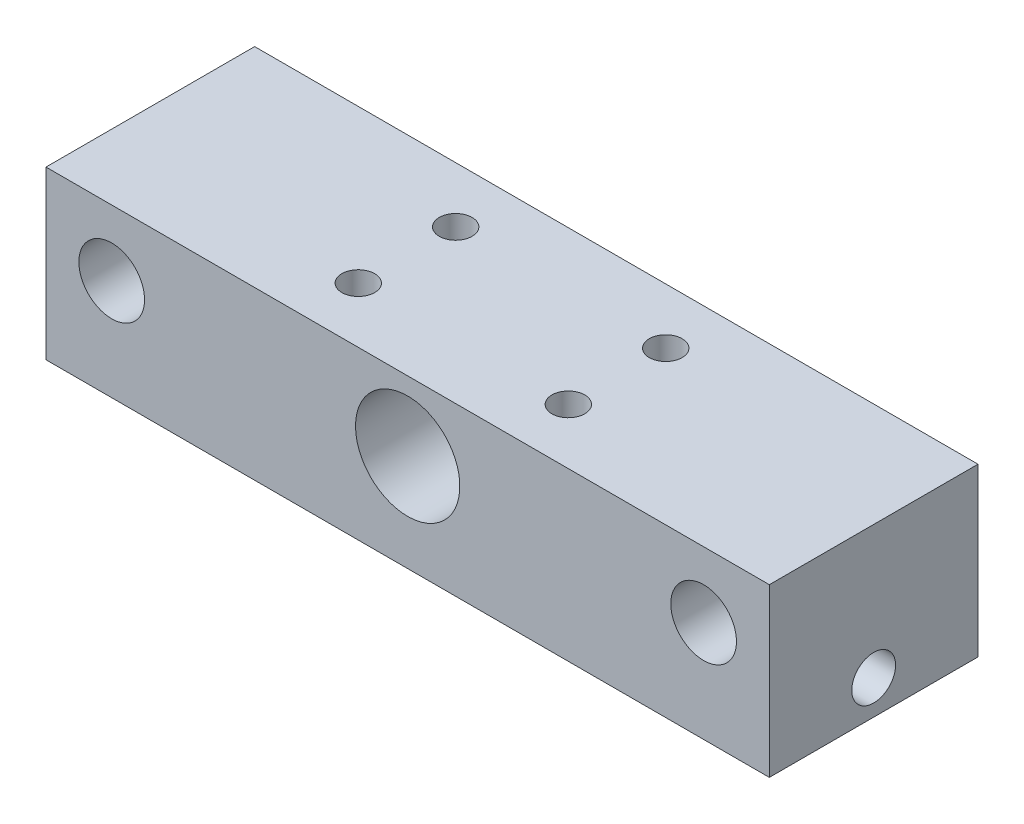
ISO-10303-21;
HEADER;
FILE_DESCRIPTION(('STEP AP214'),'2;1');
FILE_NAME('part.step','',(''),(''),'','','');
FILE_SCHEMA(('AUTOMOTIVE_DESIGN { 1 0 10303 214 1 1 1 1 }'));
ENDSEC;
DATA;
#1=APPLICATION_CONTEXT('core data for automotive mechanical design processes');
#2=APPLICATION_PROTOCOL_DEFINITION('international standard','automotive_design',2000,#1);
#3=PRODUCT_CONTEXT('',#1,'mechanical');
#4=PRODUCT('Part','Part','',(#3));
#5=PRODUCT_RELATED_PRODUCT_CATEGORY('part','',(#4));
#6=PRODUCT_DEFINITION_FORMATION('','',#4);
#7=PRODUCT_DEFINITION_CONTEXT('part definition',#1,'design');
#8=PRODUCT_DEFINITION('design','',#6,#7);
#9=PRODUCT_DEFINITION_SHAPE('','',#8);
#10=(LENGTH_UNIT() NAMED_UNIT(*) SI_UNIT(.MILLI.,.METRE.));
#11=(NAMED_UNIT(*) PLANE_ANGLE_UNIT() SI_UNIT($,.RADIAN.));
#12=(NAMED_UNIT(*) SI_UNIT($,.STERADIAN.) SOLID_ANGLE_UNIT());
#13=UNCERTAINTY_MEASURE_WITH_UNIT(LENGTH_MEASURE(1.E-05),#10,'distance_accuracy_value','');
#14=(GEOMETRIC_REPRESENTATION_CONTEXT(3) GLOBAL_UNCERTAINTY_ASSIGNED_CONTEXT((#13)) GLOBAL_UNIT_ASSIGNED_CONTEXT((#10,
#11,#12)) REPRESENTATION_CONTEXT('',''));
#15=CARTESIAN_POINT('',(0.,0.,0.));
#16=DIRECTION('',(0.,0.,1.));
#17=DIRECTION('',(1.,0.,0.));
#18=AXIS2_PLACEMENT_3D('',#15,#16,#17);
#19=CARTESIAN_POINT('',(0.,6.35,19.05));
#20=DIRECTION('',(0.,1.,0.));
#21=DIRECTION('',(0.,0.,1.));
#22=AXIS2_PLACEMENT_3D('',#19,#20,#21);
#23=PLANE('',#22);
#24=CARTESIAN_POINT('',(9.5885,6.35,13.97));
#25=DIRECTION('',(0.,1.,0.));
#26=DIRECTION('',(0.,0.,1.));
#27=AXIS2_PLACEMENT_3D('',#24,#25,#26);
#28=CIRCLE('',#27,1.4986);
#29=CARTESIAN_POINT('',(9.5885,6.35,15.4686));
#30=VERTEX_POINT('',#29);
#31=EDGE_CURVE('E155',#30,#30,#28,.F.);
#32=ORIENTED_EDGE('',*,*,#31,.T.);
#33=EDGE_LOOP('',(#32));
#34=FACE_BOUND('',#33,.T.);
#35=CARTESIAN_POINT('',(9.5885,6.35,5.08000000000001));
#36=DIRECTION('',(0.,1.,0.));
#37=DIRECTION('',(0.,0.,1.));
#38=AXIS2_PLACEMENT_3D('',#35,#36,#37);
#39=CIRCLE('',#38,1.4986);
#40=CARTESIAN_POINT('',(9.5885,6.35,6.57860000000001));
#41=VERTEX_POINT('',#40);
#42=EDGE_CURVE('E156',#41,#41,#39,.T.);
#43=ORIENTED_EDGE('',*,*,#42,.F.);
#44=EDGE_LOOP('',(#43));
#45=FACE_BOUND('',#44,.T.);
#46=CARTESIAN_POINT('',(-9.5885,6.35,13.97));
#47=DIRECTION('',(0.,1.,0.));
#48=DIRECTION('',(0.,0.,1.));
#49=AXIS2_PLACEMENT_3D('',#46,#47,#48);
#50=CIRCLE('',#49,1.4986);
#51=CARTESIAN_POINT('',(-9.5885,6.35,15.4686));
#52=VERTEX_POINT('',#51);
#53=EDGE_CURVE('E146',#52,#52,#50,.T.);
#54=ORIENTED_EDGE('',*,*,#53,.F.);
#55=EDGE_LOOP('',(#54));
#56=FACE_BOUND('',#55,.T.);
#57=DIRECTION('',(1.,0.,0.));
#58=VECTOR('',#57,1.);
#59=CARTESIAN_POINT('',(0.,6.35,0.));
#60=LINE('',#59,#58);
#61=CARTESIAN_POINT('',(-33.02,6.35,0.));
#62=VERTEX_POINT('',#61);
#63=CARTESIAN_POINT('',(33.02,6.35,0.));
#64=VERTEX_POINT('',#63);
#65=EDGE_CURVE('E121',#62,#64,#60,.T.);
#66=ORIENTED_EDGE('',*,*,#65,.F.);
#67=DIRECTION('',(0.,0.,-1.));
#68=VECTOR('',#67,1.);
#69=CARTESIAN_POINT('',(-33.02,6.35,19.05));
#70=LINE('',#69,#68);
#71=CARTESIAN_POINT('',(-33.02,6.35,19.05));
#72=VERTEX_POINT('',#71);
#73=EDGE_CURVE('E54',#72,#62,#70,.T.);
#74=ORIENTED_EDGE('',*,*,#73,.F.);
#75=DIRECTION('',(1.,0.,0.));
#76=VECTOR('',#75,1.);
#77=CARTESIAN_POINT('',(0.,6.35,19.05));
#78=LINE('',#77,#76);
#79=CARTESIAN_POINT('',(33.02,6.35,19.05));
#80=VERTEX_POINT('',#79);
#81=EDGE_CURVE('E132',#72,#80,#78,.T.);
#82=ORIENTED_EDGE('',*,*,#81,.T.);
#83=DIRECTION('',(0.,0.,-1.));
#84=VECTOR('',#83,1.);
#85=CARTESIAN_POINT('',(33.02,6.35,19.05));
#86=LINE('',#85,#84);
#87=EDGE_CURVE('E12',#80,#64,#86,.T.);
#88=ORIENTED_EDGE('',*,*,#87,.T.);
#89=EDGE_LOOP('',(#66,#74,#82,#88));
#90=FACE_BOUND('',#89,.T.);
#91=CARTESIAN_POINT('',(-9.5885,6.35,5.08000000000001));
#92=DIRECTION('',(0.,1.,0.));
#93=DIRECTION('',(0.,0.,1.));
#94=AXIS2_PLACEMENT_3D('',#91,#92,#93);
#95=CIRCLE('',#94,1.4986);
#96=CARTESIAN_POINT('',(-9.5885,6.35,6.57860000000001));
#97=VERTEX_POINT('',#96);
#98=EDGE_CURVE('E149',#97,#97,#95,.F.);
#99=ORIENTED_EDGE('',*,*,#98,.T.);
#100=EDGE_LOOP('',(#99));
#101=FACE_BOUND('',#100,.T.);
#102=ADVANCED_FACE('F44',(#34,#45,#56,#90,#101),#23,.T.);
#103=CARTESIAN_POINT('',(-33.02,0.,19.05));
#104=DIRECTION('',(1.,0.,0.));
#105=DIRECTION('',(0.,0.,-1.));
#106=AXIS2_PLACEMENT_3D('',#103,#104,#105);
#107=PLANE('',#106);
#108=CARTESIAN_POINT('',(-33.02,-5.76961,9.525));
#109=DIRECTION('',(-1.,0.,0.));
#110=DIRECTION('',(0.,0.,1.));
#111=AXIS2_PLACEMENT_3D('',#108,#109,#110);
#112=CIRCLE('',#111,2.00025);
#113=CARTESIAN_POINT('',(-33.02,-5.76961,11.52525));
#114=VERTEX_POINT('',#113);
#115=EDGE_CURVE('E106',#114,#114,#112,.T.);
#116=ORIENTED_EDGE('',*,*,#115,.F.);
#117=EDGE_LOOP('',(#116));
#118=FACE_BOUND('',#117,.T.);
#119=DIRECTION('',(0.,-1.,0.));
#120=VECTOR('',#119,1.);
#121=CARTESIAN_POINT('',(-33.02,0.,0.));
#122=LINE('',#121,#120);
#123=CARTESIAN_POINT('',(-33.02,-8.89,0.));
#124=VERTEX_POINT('',#123);
#125=EDGE_CURVE('E88',#62,#124,#122,.T.);
#126=ORIENTED_EDGE('',*,*,#125,.T.);
#127=DIRECTION('',(0.,0.,-1.));
#128=VECTOR('',#127,1.);
#129=CARTESIAN_POINT('',(-33.02,-8.89,19.05));
#130=LINE('',#129,#128);
#131=CARTESIAN_POINT('',(-33.02,-8.89,19.05));
#132=VERTEX_POINT('',#131);
#133=EDGE_CURVE('E91',#132,#124,#130,.T.);
#134=ORIENTED_EDGE('',*,*,#133,.F.);
#135=DIRECTION('',(0.,-1.,0.));
#136=VECTOR('',#135,1.);
#137=CARTESIAN_POINT('',(-33.02,0.,19.05));
#138=LINE('',#137,#136);
#139=EDGE_CURVE('E114',#72,#132,#138,.T.);
#140=ORIENTED_EDGE('',*,*,#139,.F.);
#141=ORIENTED_EDGE('',*,*,#73,.T.);
#142=EDGE_LOOP('',(#126,#134,#140,#141));
#143=FACE_BOUND('',#142,.T.);
#144=ADVANCED_FACE('F90',(#118,#143),#107,.F.);
#145=CARTESIAN_POINT('',(33.02,0.,19.05));
#146=DIRECTION('',(1.,0.,0.));
#147=DIRECTION('',(0.,0.,-1.));
#148=AXIS2_PLACEMENT_3D('',#145,#146,#147);
#149=PLANE('',#148);
#150=CARTESIAN_POINT('',(33.02,-5.76961,9.525));
#151=DIRECTION('',(1.,0.,0.));
#152=DIRECTION('',(0.,0.,-1.));
#153=AXIS2_PLACEMENT_3D('',#150,#151,#152);
#154=CIRCLE('',#153,2.00025);
#155=CARTESIAN_POINT('',(33.02,-5.76961,7.52475));
#156=VERTEX_POINT('',#155);
#157=EDGE_CURVE('E140',#156,#156,#154,.T.);
#158=ORIENTED_EDGE('',*,*,#157,.F.);
#159=EDGE_LOOP('',(#158));
#160=FACE_BOUND('',#159,.T.);
#161=DIRECTION('',(0.,-1.,0.));
#162=VECTOR('',#161,1.);
#163=CARTESIAN_POINT('',(33.02,0.,0.));
#164=LINE('',#163,#162);
#165=CARTESIAN_POINT('',(33.02,-8.89,0.));
#166=VERTEX_POINT('',#165);
#167=EDGE_CURVE('E82',#64,#166,#164,.T.);
#168=ORIENTED_EDGE('',*,*,#167,.F.);
#169=ORIENTED_EDGE('',*,*,#87,.F.);
#170=DIRECTION('',(0.,-1.,0.));
#171=VECTOR('',#170,1.);
#172=CARTESIAN_POINT('',(33.02,0.,19.05));
#173=LINE('',#172,#171);
#174=CARTESIAN_POINT('',(33.02,-8.89,19.05));
#175=VERTEX_POINT('',#174);
#176=EDGE_CURVE('E134',#80,#175,#173,.T.);
#177=ORIENTED_EDGE('',*,*,#176,.T.);
#178=DIRECTION('',(0.,0.,-1.));
#179=VECTOR('',#178,1.);
#180=CARTESIAN_POINT('',(33.02,-8.89,19.05));
#181=LINE('',#180,#179);
#182=EDGE_CURVE('E48',#175,#166,#181,.T.);
#183=ORIENTED_EDGE('',*,*,#182,.T.);
#184=EDGE_LOOP('',(#168,#169,#177,#183));
#185=FACE_BOUND('',#184,.T.);
#186=ADVANCED_FACE('F240',(#160,#185),#149,.T.);
#187=CARTESIAN_POINT('',(-27.02052,0.35052,19.05));
#188=DIRECTION('',(0.,0.,-1.));
#189=DIRECTION('',(-1.,0.,0.));
#190=AXIS2_PLACEMENT_3D('',#187,#188,#189);
#191=CYLINDRICAL_SURFACE('',#190,2.99974);
#192=CARTESIAN_POINT('',(-27.02052,0.35052,19.05));
#193=DIRECTION('',(0.,0.,1.));
#194=DIRECTION('',(1.,0.,0.));
#195=AXIS2_PLACEMENT_3D('',#192,#193,#194);
#196=CIRCLE('',#195,2.99974);
#197=CARTESIAN_POINT('',(-30.02026,0.35052,19.05));
#198=VERTEX_POINT('',#197);
#199=EDGE_CURVE('E126',#198,#198,#196,.T.);
#200=CARTESIAN_POINT('',(-27.02052,0.35052,0.));
#201=DIRECTION('',(0.,0.,1.));
#202=DIRECTION('',(1.,0.,0.));
#203=AXIS2_PLACEMENT_3D('',#200,#201,#202);
#204=CIRCLE('',#203,2.99974);
#205=CARTESIAN_POINT('',(-30.02026,0.35052,0.));
#206=VERTEX_POINT('',#205);
#207=EDGE_CURVE('E115',#206,#206,#204,.T.);
#208=CARTESIAN_POINT('',(-30.02026,0.35052,19.05));
#209=CARTESIAN_POINT('',(-30.02026,0.35052,18.8515625));
#210=CARTESIAN_POINT('',(-30.02026,0.35052,18.653125));
#211=CARTESIAN_POINT('',(-30.02026,0.35052,18.25625));
#212=CARTESIAN_POINT('',(-30.02026,0.35052,18.0578125));
#213=CARTESIAN_POINT('',(-30.02026,0.35052,17.6609375));
#214=CARTESIAN_POINT('',(-30.02026,0.35052,17.4625));
#215=CARTESIAN_POINT('',(-30.02026,0.35052,17.065625));
#216=CARTESIAN_POINT('',(-30.02026,0.35052,16.8671875));
#217=CARTESIAN_POINT('',(-30.02026,0.35052,16.4703125));
#218=CARTESIAN_POINT('',(-30.02026,0.35052,16.271875));
#219=CARTESIAN_POINT('',(-30.02026,0.35052,15.875));
#220=CARTESIAN_POINT('',(-30.02026,0.35052,15.6765625));
#221=CARTESIAN_POINT('',(-30.02026,0.35052,15.2796875));
#222=CARTESIAN_POINT('',(-30.02026,0.35052,15.08125));
#223=CARTESIAN_POINT('',(-30.02026,0.35052,14.684375));
#224=CARTESIAN_POINT('',(-30.02026,0.35052,14.4859375));
#225=CARTESIAN_POINT('',(-30.02026,0.35052,14.0890625));
#226=CARTESIAN_POINT('',(-30.02026,0.35052,13.890625));
#227=CARTESIAN_POINT('',(-30.02026,0.35052,13.49375));
#228=CARTESIAN_POINT('',(-30.02026,0.35052,13.2953125));
#229=CARTESIAN_POINT('',(-30.02026,0.35052,12.8984375));
#230=CARTESIAN_POINT('',(-30.02026,0.35052,12.7));
#231=CARTESIAN_POINT('',(-30.02026,0.35052,12.303125));
#232=CARTESIAN_POINT('',(-30.02026,0.35052,12.1046875));
#233=CARTESIAN_POINT('',(-30.02026,0.35052,11.7078125));
#234=CARTESIAN_POINT('',(-30.02026,0.35052,11.509375));
#235=CARTESIAN_POINT('',(-30.02026,0.35052,11.1125));
#236=CARTESIAN_POINT('',(-30.02026,0.35052,10.9140625));
#237=CARTESIAN_POINT('',(-30.02026,0.35052,10.5171875));
#238=CARTESIAN_POINT('',(-30.02026,0.35052,10.31875));
#239=CARTESIAN_POINT('',(-30.02026,0.35052,9.921875));
#240=CARTESIAN_POINT('',(-30.02026,0.35052,9.7234375));
#241=CARTESIAN_POINT('',(-30.02026,0.35052,9.3265625));
#242=CARTESIAN_POINT('',(-30.02026,0.35052,9.128125));
#243=CARTESIAN_POINT('',(-30.02026,0.35052,8.73125));
#244=CARTESIAN_POINT('',(-30.02026,0.35052,8.5328125));
#245=CARTESIAN_POINT('',(-30.02026,0.35052,8.1359375));
#246=CARTESIAN_POINT('',(-30.02026,0.35052,7.9375));
#247=CARTESIAN_POINT('',(-30.02026,0.35052,7.540625));
#248=CARTESIAN_POINT('',(-30.02026,0.35052,7.3421875));
#249=CARTESIAN_POINT('',(-30.02026,0.35052,6.9453125));
#250=CARTESIAN_POINT('',(-30.02026,0.35052,6.746875));
#251=CARTESIAN_POINT('',(-30.02026,0.35052,6.35));
#252=CARTESIAN_POINT('',(-30.02026,0.35052,6.1515625));
#253=CARTESIAN_POINT('',(-30.02026,0.35052,5.7546875));
#254=CARTESIAN_POINT('',(-30.02026,0.35052,5.55625));
#255=CARTESIAN_POINT('',(-30.02026,0.35052,5.159375));
#256=CARTESIAN_POINT('',(-30.02026,0.35052,4.9609375));
#257=CARTESIAN_POINT('',(-30.02026,0.35052,4.5640625));
#258=CARTESIAN_POINT('',(-30.02026,0.35052,4.365625));
#259=CARTESIAN_POINT('',(-30.02026,0.35052,3.96875));
#260=CARTESIAN_POINT('',(-30.02026,0.35052,3.7703125));
#261=CARTESIAN_POINT('',(-30.02026,0.35052,3.3734375));
#262=CARTESIAN_POINT('',(-30.02026,0.35052,3.175));
#263=CARTESIAN_POINT('',(-30.02026,0.35052,2.778125));
#264=CARTESIAN_POINT('',(-30.02026,0.35052,2.5796875));
#265=CARTESIAN_POINT('',(-30.02026,0.35052,2.1828125));
#266=CARTESIAN_POINT('',(-30.02026,0.35052,1.984375));
#267=CARTESIAN_POINT('',(-30.02026,0.35052,1.5875));
#268=CARTESIAN_POINT('',(-30.02026,0.35052,1.3890625));
#269=CARTESIAN_POINT('',(-30.02026,0.35052,0.992187500000001));
#270=CARTESIAN_POINT('',(-30.02026,0.35052,0.793750000000001));
#271=CARTESIAN_POINT('',(-30.02026,0.35052,0.396875));
#272=CARTESIAN_POINT('',(-30.02026,0.35052,0.1984375));
#273=CARTESIAN_POINT('',(-30.02026,0.35052,0.));
#274=B_SPLINE_CURVE_WITH_KNOTS('',3,(#208,#209,#210,#211,#212,#213,#214,#215,#216,#217,#218,
#219,#220,#221,#222,#223,#224,#225,#226,#227,#228,#229,#230,#231,#232,#233,#234,#235,#236,#237,
#238,#239,#240,#241,#242,#243,#244,#245,#246,#247,#248,#249,#250,#251,#252,#253,#254,#255,#256,
#257,#258,#259,#260,#261,#262,#263,#264,#265,#266,#267,#268,#269,#270,#271,#272,#273),
.UNSPECIFIED.,.F.,.F.,(4,2,2,2,2,2,2,2,2,2,2,2,2,2,2,2,2,2,2,2,2,2,2,2,2,2,2,2,2,2,2,2,4),(0.,
0.595312499999997,1.190625,1.7859375,2.38125,2.9765625,3.571875,4.1671875,4.7625,5.3578125,
5.953125,6.5484375,7.14375,7.7390625,8.334375,8.9296875,9.525,10.1203125,10.715625,11.3109375,
11.90625,12.5015625,13.096875,13.6921875,14.2875,14.8828125,15.478125,16.0734375,16.66875,
17.2640625,17.859375,18.4546875,19.05),.UNSPECIFIED.);
#275=EDGE_CURVE('BSEAM237',#198,#206,#274,.T.);
#276=ORIENTED_EDGE('',*,*,#199,.T.);
#277=ORIENTED_EDGE('',*,*,#207,.F.);
#278=ORIENTED_EDGE('',*,*,#275,.T.);
#279=ORIENTED_EDGE('',*,*,#275,.F.);
#280=EDGE_LOOP('',(#276,#278,#277,#279));
#281=FACE_BOUND('',#280,.T.);
#282=ADVANCED_FACE('F237',(#281),#191,.F.);
#283=CARTESIAN_POINT('',(0.,0.,19.05));
#284=DIRECTION('',(0.,0.,-1.));
#285=DIRECTION('',(-1.,0.,0.));
#286=AXIS2_PLACEMENT_3D('',#283,#284,#285);
#287=CYLINDRICAL_SURFACE('',#286,4.7625);
#288=CARTESIAN_POINT('',(0.,0.,19.05));
#289=DIRECTION('',(0.,0.,1.));
#290=DIRECTION('',(1.,0.,0.));
#291=AXIS2_PLACEMENT_3D('',#288,#289,#290);
#292=CIRCLE('',#291,4.7625);
#293=CARTESIAN_POINT('',(-4.7625,0.,19.05));
#294=VERTEX_POINT('',#293);
#295=EDGE_CURVE('E129',#294,#294,#292,.T.);
#296=CARTESIAN_POINT('',(0.,0.,0.));
#297=DIRECTION('',(0.,0.,1.));
#298=DIRECTION('',(1.,0.,0.));
#299=AXIS2_PLACEMENT_3D('',#296,#297,#298);
#300=CIRCLE('',#299,4.7625);
#301=CARTESIAN_POINT('',(-4.7625,0.,0.));
#302=VERTEX_POINT('',#301);
#303=EDGE_CURVE('E118',#302,#302,#300,.T.);
#304=CARTESIAN_POINT('',(-4.7625,0.,19.05));
#305=CARTESIAN_POINT('',(-4.7625,0.,18.8515625));
#306=CARTESIAN_POINT('',(-4.7625,0.,18.653125));
#307=CARTESIAN_POINT('',(-4.7625,0.,18.25625));
#308=CARTESIAN_POINT('',(-4.7625,0.,18.0578125));
#309=CARTESIAN_POINT('',(-4.7625,0.,17.6609375));
#310=CARTESIAN_POINT('',(-4.7625,0.,17.4625));
#311=CARTESIAN_POINT('',(-4.7625,0.,17.065625));
#312=CARTESIAN_POINT('',(-4.7625,0.,16.8671875));
#313=CARTESIAN_POINT('',(-4.7625,0.,16.4703125));
#314=CARTESIAN_POINT('',(-4.7625,0.,16.271875));
#315=CARTESIAN_POINT('',(-4.7625,0.,15.875));
#316=CARTESIAN_POINT('',(-4.7625,0.,15.6765625));
#317=CARTESIAN_POINT('',(-4.7625,0.,15.2796875));
#318=CARTESIAN_POINT('',(-4.7625,0.,15.08125));
#319=CARTESIAN_POINT('',(-4.7625,0.,14.684375));
#320=CARTESIAN_POINT('',(-4.7625,0.,14.4859375));
#321=CARTESIAN_POINT('',(-4.7625,0.,14.0890625));
#322=CARTESIAN_POINT('',(-4.7625,0.,13.890625));
#323=CARTESIAN_POINT('',(-4.7625,0.,13.49375));
#324=CARTESIAN_POINT('',(-4.7625,0.,13.2953125));
#325=CARTESIAN_POINT('',(-4.7625,0.,12.8984375));
#326=CARTESIAN_POINT('',(-4.7625,0.,12.7));
#327=CARTESIAN_POINT('',(-4.7625,0.,12.303125));
#328=CARTESIAN_POINT('',(-4.7625,0.,12.1046875));
#329=CARTESIAN_POINT('',(-4.7625,0.,11.7078125));
#330=CARTESIAN_POINT('',(-4.7625,0.,11.509375));
#331=CARTESIAN_POINT('',(-4.7625,0.,11.1125));
#332=CARTESIAN_POINT('',(-4.7625,0.,10.9140625));
#333=CARTESIAN_POINT('',(-4.7625,0.,10.5171875));
#334=CARTESIAN_POINT('',(-4.7625,0.,10.31875));
#335=CARTESIAN_POINT('',(-4.7625,0.,9.921875));
#336=CARTESIAN_POINT('',(-4.7625,0.,9.7234375));
#337=CARTESIAN_POINT('',(-4.7625,0.,9.3265625));
#338=CARTESIAN_POINT('',(-4.7625,0.,9.128125));
#339=CARTESIAN_POINT('',(-4.7625,0.,8.73125));
#340=CARTESIAN_POINT('',(-4.7625,0.,8.5328125));
#341=CARTESIAN_POINT('',(-4.7625,0.,8.1359375));
#342=CARTESIAN_POINT('',(-4.7625,0.,7.9375));
#343=CARTESIAN_POINT('',(-4.7625,0.,7.540625));
#344=CARTESIAN_POINT('',(-4.7625,0.,7.3421875));
#345=CARTESIAN_POINT('',(-4.7625,0.,6.9453125));
#346=CARTESIAN_POINT('',(-4.7625,0.,6.746875));
#347=CARTESIAN_POINT('',(-4.7625,0.,6.35));
#348=CARTESIAN_POINT('',(-4.7625,0.,6.1515625));
#349=CARTESIAN_POINT('',(-4.7625,0.,5.7546875));
#350=CARTESIAN_POINT('',(-4.7625,0.,5.55625));
#351=CARTESIAN_POINT('',(-4.7625,0.,5.159375));
#352=CARTESIAN_POINT('',(-4.7625,0.,4.9609375));
#353=CARTESIAN_POINT('',(-4.7625,0.,4.5640625));
#354=CARTESIAN_POINT('',(-4.7625,0.,4.365625));
#355=CARTESIAN_POINT('',(-4.7625,0.,3.96875));
#356=CARTESIAN_POINT('',(-4.7625,0.,3.7703125));
#357=CARTESIAN_POINT('',(-4.7625,0.,3.3734375));
#358=CARTESIAN_POINT('',(-4.7625,0.,3.175));
#359=CARTESIAN_POINT('',(-4.7625,0.,2.778125));
#360=CARTESIAN_POINT('',(-4.7625,0.,2.5796875));
#361=CARTESIAN_POINT('',(-4.7625,0.,2.1828125));
#362=CARTESIAN_POINT('',(-4.7625,0.,1.984375));
#363=CARTESIAN_POINT('',(-4.7625,0.,1.5875));
#364=CARTESIAN_POINT('',(-4.7625,0.,1.3890625));
#365=CARTESIAN_POINT('',(-4.7625,0.,0.992187500000001));
#366=CARTESIAN_POINT('',(-4.7625,0.,0.793750000000001));
#367=CARTESIAN_POINT('',(-4.7625,0.,0.396875));
#368=CARTESIAN_POINT('',(-4.7625,0.,0.1984375));
#369=CARTESIAN_POINT('',(-4.7625,0.,0.));
#370=B_SPLINE_CURVE_WITH_KNOTS('',3,(#304,#305,#306,#307,#308,#309,#310,#311,#312,#313,#314,
#315,#316,#317,#318,#319,#320,#321,#322,#323,#324,#325,#326,#327,#328,#329,#330,#331,#332,#333,
#334,#335,#336,#337,#338,#339,#340,#341,#342,#343,#344,#345,#346,#347,#348,#349,#350,#351,#352,
#353,#354,#355,#356,#357,#358,#359,#360,#361,#362,#363,#364,#365,#366,#367,#368,#369),
.UNSPECIFIED.,.F.,.F.,(4,2,2,2,2,2,2,2,2,2,2,2,2,2,2,2,2,2,2,2,2,2,2,2,2,2,2,2,2,2,2,2,4),(0.,
0.5953125,1.190625,1.7859375,2.38125,2.9765625,3.571875,4.1671875,4.7625,5.3578125,5.953125,
6.5484375,7.14375,7.7390625,8.334375,8.9296875,9.525,10.1203125,10.715625,11.3109375,11.90625,
12.5015625,13.096875,13.6921875,14.2875,14.8828125,15.478125,16.0734375,16.66875,17.2640625,
17.859375,18.4546875,19.05),.UNSPECIFIED.);
#371=EDGE_CURVE('BSEAM235',#294,#302,#370,.T.);
#372=ORIENTED_EDGE('',*,*,#295,.T.);
#373=ORIENTED_EDGE('',*,*,#303,.F.);
#374=ORIENTED_EDGE('',*,*,#371,.T.);
#375=ORIENTED_EDGE('',*,*,#371,.F.);
#376=EDGE_LOOP('',(#372,#374,#373,#375));
#377=FACE_BOUND('',#376,.T.);
#378=ADVANCED_FACE('F235',(#377),#287,.F.);
#379=CARTESIAN_POINT('',(27.02052,0.35052,19.05));
#380=DIRECTION('',(0.,0.,-1.));
#381=DIRECTION('',(-1.,0.,0.));
#382=AXIS2_PLACEMENT_3D('',#379,#380,#381);
#383=CYLINDRICAL_SURFACE('',#382,2.99974);
#384=CARTESIAN_POINT('',(27.02052,0.35052,19.05));
#385=DIRECTION('',(0.,0.,1.));
#386=DIRECTION('',(1.,0.,0.));
#387=AXIS2_PLACEMENT_3D('',#384,#385,#386);
#388=CIRCLE('',#387,2.99974);
#389=CARTESIAN_POINT('',(24.02078,0.35052,19.05));
#390=VERTEX_POINT('',#389);
#391=EDGE_CURVE('E110',#390,#390,#388,.F.);
#392=CARTESIAN_POINT('',(27.02052,0.35052,0.));
#393=DIRECTION('',(0.,0.,1.));
#394=DIRECTION('',(1.,0.,0.));
#395=AXIS2_PLACEMENT_3D('',#392,#393,#394);
#396=CIRCLE('',#395,2.99974);
#397=CARTESIAN_POINT('',(24.02078,0.35052,0.));
#398=VERTEX_POINT('',#397);
#399=EDGE_CURVE('E111',#398,#398,#396,.F.);
#400=CARTESIAN_POINT('',(24.02078,0.35052,19.05));
#401=CARTESIAN_POINT('',(24.02078,0.35052,18.8515625));
#402=CARTESIAN_POINT('',(24.02078,0.35052,18.653125));
#403=CARTESIAN_POINT('',(24.02078,0.35052,18.25625));
#404=CARTESIAN_POINT('',(24.02078,0.35052,18.0578125));
#405=CARTESIAN_POINT('',(24.02078,0.35052,17.6609375));
#406=CARTESIAN_POINT('',(24.02078,0.35052,17.4625));
#407=CARTESIAN_POINT('',(24.02078,0.35052,17.065625));
#408=CARTESIAN_POINT('',(24.02078,0.35052,16.8671875));
#409=CARTESIAN_POINT('',(24.02078,0.35052,16.4703125));
#410=CARTESIAN_POINT('',(24.02078,0.35052,16.271875));
#411=CARTESIAN_POINT('',(24.02078,0.35052,15.875));
#412=CARTESIAN_POINT('',(24.02078,0.35052,15.6765625));
#413=CARTESIAN_POINT('',(24.02078,0.35052,15.2796875));
#414=CARTESIAN_POINT('',(24.02078,0.35052,15.08125));
#415=CARTESIAN_POINT('',(24.02078,0.35052,14.684375));
#416=CARTESIAN_POINT('',(24.02078,0.35052,14.4859375));
#417=CARTESIAN_POINT('',(24.02078,0.35052,14.0890625));
#418=CARTESIAN_POINT('',(24.02078,0.35052,13.890625));
#419=CARTESIAN_POINT('',(24.02078,0.35052,13.49375));
#420=CARTESIAN_POINT('',(24.02078,0.35052,13.2953125));
#421=CARTESIAN_POINT('',(24.02078,0.35052,12.8984375));
#422=CARTESIAN_POINT('',(24.02078,0.35052,12.7));
#423=CARTESIAN_POINT('',(24.02078,0.35052,12.303125));
#424=CARTESIAN_POINT('',(24.02078,0.35052,12.1046875));
#425=CARTESIAN_POINT('',(24.02078,0.35052,11.7078125));
#426=CARTESIAN_POINT('',(24.02078,0.35052,11.509375));
#427=CARTESIAN_POINT('',(24.02078,0.35052,11.1125));
#428=CARTESIAN_POINT('',(24.02078,0.35052,10.9140625));
#429=CARTESIAN_POINT('',(24.02078,0.35052,10.5171875));
#430=CARTESIAN_POINT('',(24.02078,0.35052,10.31875));
#431=CARTESIAN_POINT('',(24.02078,0.35052,9.921875));
#432=CARTESIAN_POINT('',(24.02078,0.35052,9.7234375));
#433=CARTESIAN_POINT('',(24.02078,0.35052,9.3265625));
#434=CARTESIAN_POINT('',(24.02078,0.35052,9.128125));
#435=CARTESIAN_POINT('',(24.02078,0.35052,8.73125));
#436=CARTESIAN_POINT('',(24.02078,0.35052,8.5328125));
#437=CARTESIAN_POINT('',(24.02078,0.35052,8.1359375));
#438=CARTESIAN_POINT('',(24.02078,0.35052,7.9375));
#439=CARTESIAN_POINT('',(24.02078,0.35052,7.540625));
#440=CARTESIAN_POINT('',(24.02078,0.35052,7.3421875));
#441=CARTESIAN_POINT('',(24.02078,0.35052,6.9453125));
#442=CARTESIAN_POINT('',(24.02078,0.35052,6.746875));
#443=CARTESIAN_POINT('',(24.02078,0.35052,6.35));
#444=CARTESIAN_POINT('',(24.02078,0.35052,6.1515625));
#445=CARTESIAN_POINT('',(24.02078,0.35052,5.7546875));
#446=CARTESIAN_POINT('',(24.02078,0.35052,5.55625));
#447=CARTESIAN_POINT('',(24.02078,0.35052,5.159375));
#448=CARTESIAN_POINT('',(24.02078,0.35052,4.9609375));
#449=CARTESIAN_POINT('',(24.02078,0.35052,4.5640625));
#450=CARTESIAN_POINT('',(24.02078,0.35052,4.365625));
#451=CARTESIAN_POINT('',(24.02078,0.35052,3.96875));
#452=CARTESIAN_POINT('',(24.02078,0.35052,3.7703125));
#453=CARTESIAN_POINT('',(24.02078,0.35052,3.3734375));
#454=CARTESIAN_POINT('',(24.02078,0.35052,3.175));
#455=CARTESIAN_POINT('',(24.02078,0.35052,2.778125));
#456=CARTESIAN_POINT('',(24.02078,0.35052,2.5796875));
#457=CARTESIAN_POINT('',(24.02078,0.35052,2.1828125));
#458=CARTESIAN_POINT('',(24.02078,0.35052,1.984375));
#459=CARTESIAN_POINT('',(24.02078,0.35052,1.5875));
#460=CARTESIAN_POINT('',(24.02078,0.35052,1.3890625));
#461=CARTESIAN_POINT('',(24.02078,0.35052,0.992187500000001));
#462=CARTESIAN_POINT('',(24.02078,0.35052,0.793750000000001));
#463=CARTESIAN_POINT('',(24.02078,0.35052,0.396875));
#464=CARTESIAN_POINT('',(24.02078,0.35052,0.1984375));
#465=CARTESIAN_POINT('',(24.02078,0.35052,0.));
#466=B_SPLINE_CURVE_WITH_KNOTS('',3,(#400,#401,#402,#403,#404,#405,#406,#407,#408,#409,#410,
#411,#412,#413,#414,#415,#416,#417,#418,#419,#420,#421,#422,#423,#424,#425,#426,#427,#428,#429,
#430,#431,#432,#433,#434,#435,#436,#437,#438,#439,#440,#441,#442,#443,#444,#445,#446,#447,#448,
#449,#450,#451,#452,#453,#454,#455,#456,#457,#458,#459,#460,#461,#462,#463,#464,#465),
.UNSPECIFIED.,.F.,.F.,(4,2,2,2,2,2,2,2,2,2,2,2,2,2,2,2,2,2,2,2,2,2,2,2,2,2,2,2,2,2,2,2,4),(0.,
0.595312499999997,1.190625,1.7859375,2.38125,2.9765625,3.571875,4.1671875,4.7625,5.3578125,
5.953125,6.5484375,7.14375,7.7390625,8.334375,8.9296875,9.525,10.1203125,10.715625,11.3109375,
11.90625,12.5015625,13.096875,13.6921875,14.2875,14.8828125,15.478125,16.0734375,16.66875,
17.2640625,17.859375,18.4546875,19.05),.UNSPECIFIED.);
#467=EDGE_CURVE('BSEAM229',#390,#398,#466,.T.);
#468=ORIENTED_EDGE('',*,*,#391,.F.);
#469=ORIENTED_EDGE('',*,*,#399,.T.);
#470=ORIENTED_EDGE('',*,*,#467,.T.);
#471=ORIENTED_EDGE('',*,*,#467,.F.);
#472=EDGE_LOOP('',(#468,#470,#469,#471));
#473=FACE_BOUND('',#472,.T.);
#474=ADVANCED_FACE('F229',(#473),#383,.F.);
#475=CARTESIAN_POINT('',(0.,0.,19.05));
#476=DIRECTION('',(0.,0.,1.));
#477=DIRECTION('',(1.,0.,0.));
#478=AXIS2_PLACEMENT_3D('',#475,#476,#477);
#479=PLANE('',#478);
#480=ORIENTED_EDGE('',*,*,#139,.T.);
#481=DIRECTION('',(1.,0.,0.));
#482=VECTOR('',#481,1.);
#483=CARTESIAN_POINT('',(-33.02,-8.89,19.05));
#484=LINE('',#483,#482);
#485=EDGE_CURVE('E99',#132,#175,#484,.T.);
#486=ORIENTED_EDGE('',*,*,#485,.T.);
#487=ORIENTED_EDGE('',*,*,#176,.F.);
#488=ORIENTED_EDGE('',*,*,#81,.F.);
#489=EDGE_LOOP('',(#480,#486,#487,#488));
#490=FACE_BOUND('',#489,.T.);
#491=ORIENTED_EDGE('',*,*,#295,.F.);
#492=EDGE_LOOP('',(#491));
#493=FACE_BOUND('',#492,.T.);
#494=ORIENTED_EDGE('',*,*,#199,.F.);
#495=EDGE_LOOP('',(#494));
#496=FACE_BOUND('',#495,.T.);
#497=ORIENTED_EDGE('',*,*,#391,.T.);
#498=EDGE_LOOP('',(#497));
#499=FACE_BOUND('',#498,.T.);
#500=ADVANCED_FACE('F226',(#490,#493,#496,#499),#479,.T.);
#501=CARTESIAN_POINT('',(0.,0.,0.));
#502=DIRECTION('',(0.,0.,1.));
#503=DIRECTION('',(1.,0.,0.));
#504=AXIS2_PLACEMENT_3D('',#501,#502,#503);
#505=PLANE('',#504);
#506=ORIENTED_EDGE('',*,*,#125,.F.);
#507=ORIENTED_EDGE('',*,*,#65,.T.);
#508=ORIENTED_EDGE('',*,*,#167,.T.);
#509=DIRECTION('',(1.,0.,0.));
#510=VECTOR('',#509,1.);
#511=CARTESIAN_POINT('',(-33.02,-8.89,0.));
#512=LINE('',#511,#510);
#513=EDGE_CURVE('E97',#124,#166,#512,.T.);
#514=ORIENTED_EDGE('',*,*,#513,.F.);
#515=EDGE_LOOP('',(#506,#507,#508,#514));
#516=FACE_BOUND('',#515,.T.);
#517=ORIENTED_EDGE('',*,*,#303,.T.);
#518=EDGE_LOOP('',(#517));
#519=FACE_BOUND('',#518,.T.);
#520=ORIENTED_EDGE('',*,*,#207,.T.);
#521=EDGE_LOOP('',(#520));
#522=FACE_BOUND('',#521,.T.);
#523=ORIENTED_EDGE('',*,*,#399,.F.);
#524=EDGE_LOOP('',(#523));
#525=FACE_BOUND('',#524,.T.);
#526=ADVANCED_FACE('F100',(#516,#519,#522,#525),#505,.F.);
#527=CARTESIAN_POINT('',(-33.02,-8.89,19.05));
#528=DIRECTION('',(0.,1.,0.));
#529=DIRECTION('',(0.,0.,1.));
#530=AXIS2_PLACEMENT_3D('',#527,#528,#529);
#531=PLANE('',#530);
#532=ORIENTED_EDGE('',*,*,#513,.T.);
#533=ORIENTED_EDGE('',*,*,#182,.F.);
#534=ORIENTED_EDGE('',*,*,#485,.F.);
#535=ORIENTED_EDGE('',*,*,#133,.T.);
#536=EDGE_LOOP('',(#532,#533,#534,#535));
#537=FACE_BOUND('',#536,.T.);
#538=ADVANCED_FACE('F46',(#537),#531,.F.);
#539=CARTESIAN_POINT('',(-13.97,-5.76961,9.525));
#540=DIRECTION('',(-1.,0.,0.));
#541=DIRECTION('',(0.,0.,1.));
#542=AXIS2_PLACEMENT_3D('',#539,#540,#541);
#543=CYLINDRICAL_SURFACE('',#542,2.00025);
#544=CARTESIAN_POINT('',(-13.97,-5.76961,9.525));
#545=DIRECTION('',(-1.,0.,0.));
#546=DIRECTION('',(0.,0.,1.));
#547=AXIS2_PLACEMENT_3D('',#544,#545,#546);
#548=CIRCLE('',#547,2.00025);
#549=CARTESIAN_POINT('',(-13.97,-5.76961,11.52525));
#550=VERTEX_POINT('',#549);
#551=EDGE_CURVE('E102',#550,#550,#548,.T.);
#552=CARTESIAN_POINT('',(-13.97,-5.76961,11.52525));
#553=CARTESIAN_POINT('',(-14.1684375,-5.76961,11.52525));
#554=CARTESIAN_POINT('',(-14.366875,-5.76961,11.52525));
#555=CARTESIAN_POINT('',(-14.76375,-5.76961,11.52525));
#556=CARTESIAN_POINT('',(-14.9621875,-5.76961,11.52525));
#557=CARTESIAN_POINT('',(-15.3590625,-5.76961,11.52525));
#558=CARTESIAN_POINT('',(-15.5575,-5.76961,11.52525));
#559=CARTESIAN_POINT('',(-15.954375,-5.76961,11.52525));
#560=CARTESIAN_POINT('',(-16.1528125,-5.76961,11.52525));
#561=CARTESIAN_POINT('',(-16.5496875,-5.76961,11.52525));
#562=CARTESIAN_POINT('',(-16.748125,-5.76961,11.52525));
#563=CARTESIAN_POINT('',(-17.145,-5.76961,11.52525));
#564=CARTESIAN_POINT('',(-17.3434375,-5.76961,11.52525));
#565=CARTESIAN_POINT('',(-17.7403125,-5.76961,11.52525));
#566=CARTESIAN_POINT('',(-17.93875,-5.76961,11.52525));
#567=CARTESIAN_POINT('',(-18.335625,-5.76961,11.52525));
#568=CARTESIAN_POINT('',(-18.5340625,-5.76961,11.52525));
#569=CARTESIAN_POINT('',(-18.9309375,-5.76961,11.52525));
#570=CARTESIAN_POINT('',(-19.129375,-5.76961,11.52525));
#571=CARTESIAN_POINT('',(-19.52625,-5.76961,11.52525));
#572=CARTESIAN_POINT('',(-19.7246875,-5.76961,11.52525));
#573=CARTESIAN_POINT('',(-20.1215625,-5.76961,11.52525));
#574=CARTESIAN_POINT('',(-20.32,-5.76961,11.52525));
#575=CARTESIAN_POINT('',(-20.716875,-5.76961,11.52525));
#576=CARTESIAN_POINT('',(-20.9153125,-5.76961,11.52525));
#577=CARTESIAN_POINT('',(-21.3121875,-5.76961,11.52525));
#578=CARTESIAN_POINT('',(-21.510625,-5.76961,11.52525));
#579=CARTESIAN_POINT('',(-21.9075,-5.76961,11.52525));
#580=CARTESIAN_POINT('',(-22.1059375,-5.76961,11.52525));
#581=CARTESIAN_POINT('',(-22.5028125,-5.76961,11.52525));
#582=CARTESIAN_POINT('',(-22.70125,-5.76961,11.52525));
#583=CARTESIAN_POINT('',(-23.098125,-5.76961,11.52525));
#584=CARTESIAN_POINT('',(-23.2965625,-5.76961,11.52525));
#585=CARTESIAN_POINT('',(-23.6934375,-5.76961,11.52525));
#586=CARTESIAN_POINT('',(-23.891875,-5.76961,11.52525));
#587=CARTESIAN_POINT('',(-24.28875,-5.76961,11.52525));
#588=CARTESIAN_POINT('',(-24.4871875,-5.76961,11.52525));
#589=CARTESIAN_POINT('',(-24.8840625,-5.76961,11.52525));
#590=CARTESIAN_POINT('',(-25.0825,-5.76961,11.52525));
#591=CARTESIAN_POINT('',(-25.479375,-5.76961,11.52525));
#592=CARTESIAN_POINT('',(-25.6778125,-5.76961,11.52525));
#593=CARTESIAN_POINT('',(-26.0746875,-5.76961,11.52525));
#594=CARTESIAN_POINT('',(-26.273125,-5.76961,11.52525));
#595=CARTESIAN_POINT('',(-26.67,-5.76961,11.52525));
#596=CARTESIAN_POINT('',(-26.8684375,-5.76961,11.52525));
#597=CARTESIAN_POINT('',(-27.2653125,-5.76961,11.52525));
#598=CARTESIAN_POINT('',(-27.46375,-5.76961,11.52525));
#599=CARTESIAN_POINT('',(-27.860625,-5.76961,11.52525));
#600=CARTESIAN_POINT('',(-28.0590625,-5.76961,11.52525));
#601=CARTESIAN_POINT('',(-28.4559375,-5.76961,11.52525));
#602=CARTESIAN_POINT('',(-28.654375,-5.76961,11.52525));
#603=CARTESIAN_POINT('',(-29.05125,-5.76961,11.52525));
#604=CARTESIAN_POINT('',(-29.2496875,-5.76961,11.52525));
#605=CARTESIAN_POINT('',(-29.6465625,-5.76961,11.52525));
#606=CARTESIAN_POINT('',(-29.845,-5.76961,11.52525));
#607=CARTESIAN_POINT('',(-30.241875,-5.76961,11.52525));
#608=CARTESIAN_POINT('',(-30.4403125,-5.76961,11.52525));
#609=CARTESIAN_POINT('',(-30.8371875,-5.76961,11.52525));
#610=CARTESIAN_POINT('',(-31.035625,-5.76961,11.52525));
#611=CARTESIAN_POINT('',(-31.4325,-5.76961,11.52525));
#612=CARTESIAN_POINT('',(-31.6309375,-5.76961,11.52525));
#613=CARTESIAN_POINT('',(-32.0278125,-5.76961,11.52525));
#614=CARTESIAN_POINT('',(-32.22625,-5.76961,11.52525));
#615=CARTESIAN_POINT('',(-32.623125,-5.76961,11.52525));
#616=CARTESIAN_POINT('',(-32.8215625,-5.76961,11.52525));
#617=CARTESIAN_POINT('',(-33.02,-5.76961,11.52525));
#618=B_SPLINE_CURVE_WITH_KNOTS('',3,(#552,#553,#554,#555,#556,#557,#558,#559,#560,#561,#562,
#563,#564,#565,#566,#567,#568,#569,#570,#571,#572,#573,#574,#575,#576,#577,#578,#579,#580,#581,
#582,#583,#584,#585,#586,#587,#588,#589,#590,#591,#592,#593,#594,#595,#596,#597,#598,#599,#600,
#601,#602,#603,#604,#605,#606,#607,#608,#609,#610,#611,#612,#613,#614,#615,#616,#617),
.UNSPECIFIED.,.F.,.F.,(4,2,2,2,2,2,2,2,2,2,2,2,2,2,2,2,2,2,2,2,2,2,2,2,2,2,2,2,2,2,2,2,4),(0.,
0.595312499999999,1.190625,1.7859375,2.38125,2.9765625,3.571875,4.1671875,4.7625,5.3578125,
5.953125,6.5484375,7.14375,7.7390625,8.334375,8.9296875,9.525,10.1203125,10.715625,11.3109375,
11.90625,12.5015625,13.096875,13.6921875,14.2875,14.8828125,15.478125,16.0734375,16.66875,
17.2640625,17.859375,18.4546875,19.05),.UNSPECIFIED.);
#619=EDGE_CURVE('BSEAM221',#550,#114,#618,.T.);
#620=ORIENTED_EDGE('',*,*,#551,.F.);
#621=ORIENTED_EDGE('',*,*,#115,.T.);
#622=ORIENTED_EDGE('',*,*,#619,.T.);
#623=ORIENTED_EDGE('',*,*,#619,.F.);
#624=EDGE_LOOP('',(#620,#622,#621,#623));
#625=FACE_BOUND('',#624,.T.);
#626=ADVANCED_FACE('F221',(#625),#543,.F.);
#627=CARTESIAN_POINT('',(-13.97,0.,0.));
#628=DIRECTION('',(-1.,0.,0.));
#629=DIRECTION('',(0.,0.,1.));
#630=AXIS2_PLACEMENT_3D('',#627,#628,#629);
#631=PLANE('',#630);
#632=ORIENTED_EDGE('',*,*,#551,.T.);
#633=EDGE_LOOP('',(#632));
#634=FACE_BOUND('',#633,.T.);
#635=ADVANCED_FACE('F217',(#634),#631,.T.);
#636=CARTESIAN_POINT('',(13.97,-5.76961,9.525));
#637=DIRECTION('',(1.,0.,0.));
#638=DIRECTION('',(0.,0.,-1.));
#639=AXIS2_PLACEMENT_3D('',#636,#637,#638);
#640=CYLINDRICAL_SURFACE('',#639,2.00025);
#641=CARTESIAN_POINT('',(13.97,-5.76961,9.525));
#642=DIRECTION('',(1.,0.,0.));
#643=DIRECTION('',(0.,0.,-1.));
#644=AXIS2_PLACEMENT_3D('',#641,#642,#643);
#645=CIRCLE('',#644,2.00025);
#646=CARTESIAN_POINT('',(13.97,-5.76961,7.52475));
#647=VERTEX_POINT('',#646);
#648=EDGE_CURVE('E138',#647,#647,#645,.T.);
#649=CARTESIAN_POINT('',(13.97,-5.76961,7.52475));
#650=CARTESIAN_POINT('',(14.1684375,-5.76961,7.52475));
#651=CARTESIAN_POINT('',(14.366875,-5.76961,7.52475));
#652=CARTESIAN_POINT('',(14.76375,-5.76961,7.52475));
#653=CARTESIAN_POINT('',(14.9621875,-5.76961,7.52475));
#654=CARTESIAN_POINT('',(15.3590625,-5.76961,7.52475));
#655=CARTESIAN_POINT('',(15.5575,-5.76961,7.52475));
#656=CARTESIAN_POINT('',(15.954375,-5.76961,7.52475));
#657=CARTESIAN_POINT('',(16.1528125,-5.76961,7.52475));
#658=CARTESIAN_POINT('',(16.5496875,-5.76961,7.52475));
#659=CARTESIAN_POINT('',(16.748125,-5.76961,7.52475));
#660=CARTESIAN_POINT('',(17.145,-5.76961,7.52475));
#661=CARTESIAN_POINT('',(17.3434375,-5.76961,7.52475));
#662=CARTESIAN_POINT('',(17.7403125,-5.76961,7.52475));
#663=CARTESIAN_POINT('',(17.93875,-5.76961,7.52475));
#664=CARTESIAN_POINT('',(18.335625,-5.76961,7.52475));
#665=CARTESIAN_POINT('',(18.5340625,-5.76961,7.52475));
#666=CARTESIAN_POINT('',(18.9309375,-5.76961,7.52475));
#667=CARTESIAN_POINT('',(19.129375,-5.76961,7.52475));
#668=CARTESIAN_POINT('',(19.52625,-5.76961,7.52475));
#669=CARTESIAN_POINT('',(19.7246875,-5.76961,7.52475));
#670=CARTESIAN_POINT('',(20.1215625,-5.76961,7.52475));
#671=CARTESIAN_POINT('',(20.32,-5.76961,7.52475));
#672=CARTESIAN_POINT('',(20.716875,-5.76961,7.52475));
#673=CARTESIAN_POINT('',(20.9153125,-5.76961,7.52475));
#674=CARTESIAN_POINT('',(21.3121875,-5.76961,7.52475));
#675=CARTESIAN_POINT('',(21.510625,-5.76961,7.52475));
#676=CARTESIAN_POINT('',(21.9075,-5.76961,7.52475));
#677=CARTESIAN_POINT('',(22.1059375,-5.76961,7.52475));
#678=CARTESIAN_POINT('',(22.5028125,-5.76961,7.52475));
#679=CARTESIAN_POINT('',(22.70125,-5.76961,7.52475));
#680=CARTESIAN_POINT('',(23.098125,-5.76961,7.52475));
#681=CARTESIAN_POINT('',(23.2965625,-5.76961,7.52475));
#682=CARTESIAN_POINT('',(23.6934375,-5.76961,7.52475));
#683=CARTESIAN_POINT('',(23.891875,-5.76961,7.52475));
#684=CARTESIAN_POINT('',(24.28875,-5.76961,7.52475));
#685=CARTESIAN_POINT('',(24.4871875,-5.76961,7.52475));
#686=CARTESIAN_POINT('',(24.8840625,-5.76961,7.52475));
#687=CARTESIAN_POINT('',(25.0825,-5.76961,7.52475));
#688=CARTESIAN_POINT('',(25.479375,-5.76961,7.52475));
#689=CARTESIAN_POINT('',(25.6778125,-5.76961,7.52475));
#690=CARTESIAN_POINT('',(26.0746875,-5.76961,7.52475));
#691=CARTESIAN_POINT('',(26.273125,-5.76961,7.52475));
#692=CARTESIAN_POINT('',(26.67,-5.76961,7.52475));
#693=CARTESIAN_POINT('',(26.8684375,-5.76961,7.52475));
#694=CARTESIAN_POINT('',(27.2653125,-5.76961,7.52475));
#695=CARTESIAN_POINT('',(27.46375,-5.76961,7.52475));
#696=CARTESIAN_POINT('',(27.860625,-5.76961,7.52475));
#697=CARTESIAN_POINT('',(28.0590625,-5.76961,7.52475));
#698=CARTESIAN_POINT('',(28.4559375,-5.76961,7.52475));
#699=CARTESIAN_POINT('',(28.654375,-5.76961,7.52475));
#700=CARTESIAN_POINT('',(29.05125,-5.76961,7.52475));
#701=CARTESIAN_POINT('',(29.2496875,-5.76961,7.52475));
#702=CARTESIAN_POINT('',(29.6465625,-5.76961,7.52475));
#703=CARTESIAN_POINT('',(29.845,-5.76961,7.52475));
#704=CARTESIAN_POINT('',(30.241875,-5.76961,7.52475));
#705=CARTESIAN_POINT('',(30.4403125,-5.76961,7.52475));
#706=CARTESIAN_POINT('',(30.8371875,-5.76961,7.52475));
#707=CARTESIAN_POINT('',(31.035625,-5.76961,7.52475));
#708=CARTESIAN_POINT('',(31.4325,-5.76961,7.52475));
#709=CARTESIAN_POINT('',(31.6309375,-5.76961,7.52475));
#710=CARTESIAN_POINT('',(32.0278125,-5.76961,7.52475));
#711=CARTESIAN_POINT('',(32.22625,-5.76961,7.52475));
#712=CARTESIAN_POINT('',(32.623125,-5.76961,7.52475));
#713=CARTESIAN_POINT('',(32.8215625,-5.76961,7.52475));
#714=CARTESIAN_POINT('',(33.02,-5.76961,7.52475));
#715=B_SPLINE_CURVE_WITH_KNOTS('',3,(#649,#650,#651,#652,#653,#654,#655,#656,#657,#658,#659,
#660,#661,#662,#663,#664,#665,#666,#667,#668,#669,#670,#671,#672,#673,#674,#675,#676,#677,#678,
#679,#680,#681,#682,#683,#684,#685,#686,#687,#688,#689,#690,#691,#692,#693,#694,#695,#696,#697,
#698,#699,#700,#701,#702,#703,#704,#705,#706,#707,#708,#709,#710,#711,#712,#713,#714),
.UNSPECIFIED.,.F.,.F.,(4,2,2,2,2,2,2,2,2,2,2,2,2,2,2,2,2,2,2,2,2,2,2,2,2,2,2,2,2,2,2,2,4),(0.,
0.595312499999999,1.190625,1.7859375,2.38125,2.9765625,3.571875,4.1671875,4.7625,5.3578125,
5.953125,6.5484375,7.14375,7.7390625,8.334375,8.9296875,9.525,10.1203125,10.715625,11.3109375,
11.90625,12.5015625,13.096875,13.6921875,14.2875,14.8828125,15.478125,16.0734375,16.66875,
17.2640625,17.859375,18.4546875,19.05),.UNSPECIFIED.);
#716=EDGE_CURVE('BSEAM213',#647,#156,#715,.T.);
#717=ORIENTED_EDGE('',*,*,#648,.F.);
#718=ORIENTED_EDGE('',*,*,#157,.T.);
#719=ORIENTED_EDGE('',*,*,#716,.T.);
#720=ORIENTED_EDGE('',*,*,#716,.F.);
#721=EDGE_LOOP('',(#717,#719,#718,#720));
#722=FACE_BOUND('',#721,.T.);
#723=ADVANCED_FACE('F213',(#722),#640,.F.);
#724=CARTESIAN_POINT('',(13.97,-5.76961,9.525));
#725=DIRECTION('',(1.,0.,0.));
#726=DIRECTION('',(0.,0.,-1.));
#727=AXIS2_PLACEMENT_3D('',#724,#725,#726);
#728=PLANE('',#727);
#729=ORIENTED_EDGE('',*,*,#648,.T.);
#730=EDGE_LOOP('',(#729));
#731=FACE_BOUND('',#730,.T.);
#732=ADVANCED_FACE('F209',(#731),#728,.T.);
#733=CARTESIAN_POINT('',(-9.5885,-3.81,13.97));
#734=DIRECTION('',(0.,1.,0.));
#735=DIRECTION('',(0.,0.,1.));
#736=AXIS2_PLACEMENT_3D('',#733,#734,#735);
#737=CYLINDRICAL_SURFACE('',#736,1.4986);
#738=CARTESIAN_POINT('',(-9.5885,-3.81,13.97));
#739=DIRECTION('',(0.,1.,0.));
#740=DIRECTION('',(0.,0.,1.));
#741=AXIS2_PLACEMENT_3D('',#738,#739,#740);
#742=CIRCLE('',#741,1.4986);
#743=CARTESIAN_POINT('',(-9.5885,-3.81,15.4686));
#744=VERTEX_POINT('',#743);
#745=EDGE_CURVE('E143',#744,#744,#742,.T.);
#746=ORIENTED_EDGE('',*,*,#745,.F.);
#747=EDGE_LOOP('',(#746));
#748=FACE_BOUND('',#747,.T.);
#749=ORIENTED_EDGE('',*,*,#53,.T.);
#750=EDGE_LOOP('',(#749));
#751=FACE_BOUND('',#750,.T.);
#752=ADVANCED_FACE('F205',(#748,#751),#737,.F.);
#753=CARTESIAN_POINT('',(0.,-3.81,0.));
#754=DIRECTION('',(0.,1.,0.));
#755=DIRECTION('',(0.,0.,1.));
#756=AXIS2_PLACEMENT_3D('',#753,#754,#755);
#757=PLANE('',#756);
#758=ORIENTED_EDGE('',*,*,#745,.T.);
#759=EDGE_LOOP('',(#758));
#760=FACE_BOUND('',#759,.T.);
#761=ADVANCED_FACE('F202',(#760),#757,.T.);
#762=CARTESIAN_POINT('',(9.5885,-3.81,5.08000000000001));
#763=DIRECTION('',(0.,1.,0.));
#764=DIRECTION('',(0.,0.,1.));
#765=AXIS2_PLACEMENT_3D('',#762,#763,#764);
#766=CYLINDRICAL_SURFACE('',#765,1.4986);
#767=CARTESIAN_POINT('',(9.5885,-3.81,5.08000000000001));
#768=DIRECTION('',(0.,1.,0.));
#769=DIRECTION('',(0.,0.,1.));
#770=AXIS2_PLACEMENT_3D('',#767,#768,#769);
#771=CIRCLE('',#770,1.4986);
#772=CARTESIAN_POINT('',(9.5885,-3.81,6.57860000000001));
#773=VERTEX_POINT('',#772);
#774=EDGE_CURVE('E164',#773,#773,#771,.T.);
#775=ORIENTED_EDGE('',*,*,#774,.F.);
#776=EDGE_LOOP('',(#775));
#777=FACE_BOUND('',#776,.T.);
#778=ORIENTED_EDGE('',*,*,#42,.T.);
#779=EDGE_LOOP('',(#778));
#780=FACE_BOUND('',#779,.T.);
#781=ADVANCED_FACE('F170',(#777,#780),#766,.F.);
#782=CARTESIAN_POINT('',(0.,-3.81,0.));
#783=DIRECTION('',(0.,1.,0.));
#784=DIRECTION('',(0.,0.,1.));
#785=AXIS2_PLACEMENT_3D('',#782,#783,#784);
#786=PLANE('',#785);
#787=ORIENTED_EDGE('',*,*,#774,.T.);
#788=EDGE_LOOP('',(#787));
#789=FACE_BOUND('',#788,.T.);
#790=ADVANCED_FACE('F196',(#789),#786,.T.);
#791=CARTESIAN_POINT('',(9.5885,-3.81,13.97));
#792=DIRECTION('',(0.,1.,0.));
#793=DIRECTION('',(0.,0.,1.));
#794=AXIS2_PLACEMENT_3D('',#791,#792,#793);
#795=CYLINDRICAL_SURFACE('',#794,1.4986);
#796=CARTESIAN_POINT('',(9.5885,-3.81,13.97));
#797=DIRECTION('',(0.,1.,0.));
#798=DIRECTION('',(0.,0.,1.));
#799=AXIS2_PLACEMENT_3D('',#796,#797,#798);
#800=CIRCLE('',#799,1.4986);
#801=CARTESIAN_POINT('',(9.5885,-3.81,15.4686));
#802=VERTEX_POINT('',#801);
#803=EDGE_CURVE('E152',#802,#802,#800,.F.);
#804=ORIENTED_EDGE('',*,*,#803,.T.);
#805=EDGE_LOOP('',(#804));
#806=FACE_BOUND('',#805,.T.);
#807=ORIENTED_EDGE('',*,*,#31,.F.);
#808=EDGE_LOOP('',(#807));
#809=FACE_BOUND('',#808,.T.);
#810=ADVANCED_FACE('F192',(#806,#809),#795,.F.);
#811=CARTESIAN_POINT('',(0.,-3.81,0.));
#812=DIRECTION('',(0.,1.,0.));
#813=DIRECTION('',(0.,0.,1.));
#814=AXIS2_PLACEMENT_3D('',#811,#812,#813);
#815=PLANE('',#814);
#816=ORIENTED_EDGE('',*,*,#803,.F.);
#817=EDGE_LOOP('',(#816));
#818=FACE_BOUND('',#817,.T.);
#819=ADVANCED_FACE('F183',(#818),#815,.T.);
#820=CARTESIAN_POINT('',(-9.5885,-3.81,5.08000000000001));
#821=DIRECTION('',(0.,1.,0.));
#822=DIRECTION('',(0.,0.,1.));
#823=AXIS2_PLACEMENT_3D('',#820,#821,#822);
#824=CYLINDRICAL_SURFACE('',#823,1.4986);
#825=CARTESIAN_POINT('',(-9.5885,-3.81,5.08000000000001));
#826=DIRECTION('',(0.,1.,0.));
#827=DIRECTION('',(0.,0.,1.));
#828=AXIS2_PLACEMENT_3D('',#825,#826,#827);
#829=CIRCLE('',#828,1.4986);
#830=CARTESIAN_POINT('',(-9.5885,-3.81,6.57860000000001));
#831=VERTEX_POINT('',#830);
#832=EDGE_CURVE('E159',#831,#831,#829,.F.);
#833=ORIENTED_EDGE('',*,*,#832,.T.);
#834=EDGE_LOOP('',(#833));
#835=FACE_BOUND('',#834,.T.);
#836=ORIENTED_EDGE('',*,*,#98,.F.);
#837=EDGE_LOOP('',(#836));
#838=FACE_BOUND('',#837,.T.);
#839=ADVANCED_FACE('F180',(#835,#838),#824,.F.);
#840=CARTESIAN_POINT('',(0.,-3.81,0.));
#841=DIRECTION('',(0.,1.,0.));
#842=DIRECTION('',(0.,0.,1.));
#843=AXIS2_PLACEMENT_3D('',#840,#841,#842);
#844=PLANE('',#843);
#845=ORIENTED_EDGE('',*,*,#832,.F.);
#846=EDGE_LOOP('',(#845));
#847=FACE_BOUND('',#846,.T.);
#848=ADVANCED_FACE('F182',(#847),#844,.T.);
#849=CLOSED_SHELL('',(#102,#144,#186,#282,#378,#474,#500,#526,#538,#626,#635,#723,#732,#752,
#761,#781,#790,#810,#819,#839,#848));
#850=MANIFOLD_SOLID_BREP('B2',#849);
#851=ADVANCED_BREP_SHAPE_REPRESENTATION('',(#18,#850),#14);
#852=SHAPE_DEFINITION_REPRESENTATION(#9,#851);
ENDSEC;
END-ISO-10303-21;
